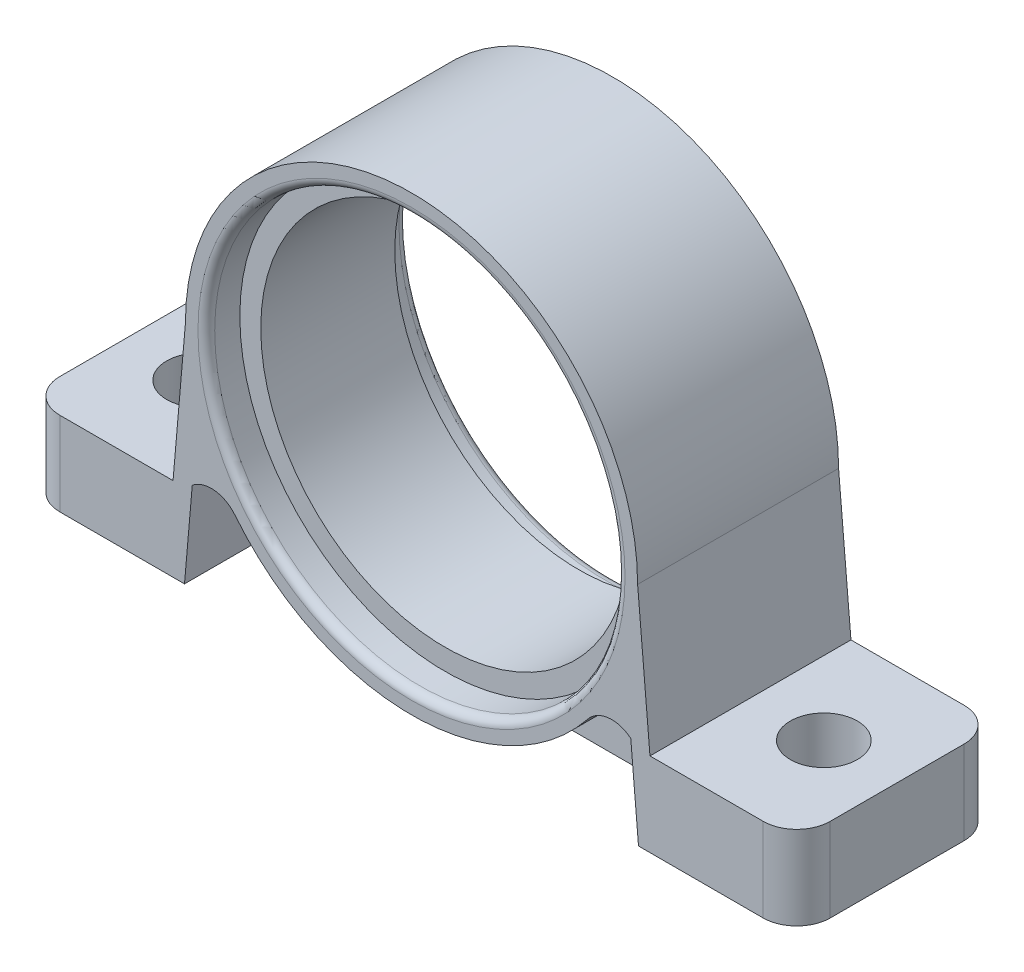
ISO-10303-21;
HEADER;
FILE_DESCRIPTION(('STEP AP214'),'2;1');
FILE_NAME('part.step','',(''),(''),'','','');
FILE_SCHEMA(('AUTOMOTIVE_DESIGN { 1 0 10303 214 1 1 1 1 }'));
ENDSEC;
DATA;
#1=APPLICATION_CONTEXT('core data for automotive mechanical design processes');
#2=APPLICATION_PROTOCOL_DEFINITION('international standard','automotive_design',2000,#1);
#3=PRODUCT_CONTEXT('',#1,'mechanical');
#4=PRODUCT('Part','Part','',(#3));
#5=PRODUCT_RELATED_PRODUCT_CATEGORY('part','',(#4));
#6=PRODUCT_DEFINITION_FORMATION('','',#4);
#7=PRODUCT_DEFINITION_CONTEXT('part definition',#1,'design');
#8=PRODUCT_DEFINITION('design','',#6,#7);
#9=PRODUCT_DEFINITION_SHAPE('','',#8);
#10=(LENGTH_UNIT() NAMED_UNIT(*) SI_UNIT(.MILLI.,.METRE.));
#11=(NAMED_UNIT(*) PLANE_ANGLE_UNIT() SI_UNIT($,.RADIAN.));
#12=(NAMED_UNIT(*) SI_UNIT($,.STERADIAN.) SOLID_ANGLE_UNIT());
#13=UNCERTAINTY_MEASURE_WITH_UNIT(LENGTH_MEASURE(1.E-05),#10,'distance_accuracy_value','');
#14=(GEOMETRIC_REPRESENTATION_CONTEXT(3) GLOBAL_UNCERTAINTY_ASSIGNED_CONTEXT((#13)) GLOBAL_UNIT_ASSIGNED_CONTEXT((#10,
#11,#12)) REPRESENTATION_CONTEXT('',''));
#15=CARTESIAN_POINT('',(0.,0.,0.));
#16=DIRECTION('',(0.,0.,1.));
#17=DIRECTION('',(1.,0.,0.));
#18=AXIS2_PLACEMENT_3D('',#15,#16,#17);
#19=CARTESIAN_POINT('',(0.,0.,6.));
#20=DIRECTION('',(0.,0.,-1.));
#21=DIRECTION('',(-1.,0.,0.));
#22=AXIS2_PLACEMENT_3D('',#19,#20,#21);
#23=CYLINDRICAL_SURFACE('',#22,11.);
#24=CARTESIAN_POINT('',(0.,0.,4.));
#25=DIRECTION('',(0.,0.,1.));
#26=DIRECTION('',(1.,0.,0.));
#27=AXIS2_PLACEMENT_3D('',#24,#25,#26);
#28=CIRCLE('',#27,11.);
#29=CARTESIAN_POINT('',(11.,0.,4.));
#30=VERTEX_POINT('',#29);
#31=EDGE_CURVE('E368',#30,#30,#28,.T.);
#32=ORIENTED_EDGE('',*,*,#31,.T.);
#33=EDGE_LOOP('',(#32));
#34=FACE_BOUND('',#33,.T.);
#35=CARTESIAN_POINT('',(0.,0.,-4.));
#36=DIRECTION('',(0.,0.,-1.));
#37=DIRECTION('',(-1.,0.,0.));
#38=AXIS2_PLACEMENT_3D('',#35,#36,#37);
#39=CIRCLE('',#38,11.);
#40=CARTESIAN_POINT('',(-11.,0.,-4.));
#41=VERTEX_POINT('',#40);
#42=EDGE_CURVE('E374',#41,#41,#39,.T.);
#43=ORIENTED_EDGE('',*,*,#42,.T.);
#44=EDGE_LOOP('',(#43));
#45=FACE_BOUND('',#44,.T.);
#46=ADVANCED_FACE('F42',(#34,#45),#23,.F.);
#47=CARTESIAN_POINT('',(12.2892180362991,1.06690695806387,-6.));
#48=DIRECTION('',(-0.99625261729607,-0.0864911702472008,0.));
#49=DIRECTION('',(0.0864911702472008,-0.99625261729607,0.));
#50=AXIS2_PLACEMENT_3D('',#47,#48,#49);
#51=PLANE('',#50);
#52=DIRECTION('',(0.,0.,1.));
#53=VECTOR('',#52,1.);
#54=CARTESIAN_POINT('',(13.0907777832913,-8.16589673250727,-6.));
#55=LINE('',#54,#53);
#56=CARTESIAN_POINT('',(13.0907777832913,-8.16589673250727,2.));
#57=VERTEX_POINT('',#56);
#58=CARTESIAN_POINT('',(13.0907777832913,-8.16589673250727,6.));
#59=VERTEX_POINT('',#58);
#60=EDGE_CURVE('E273',#57,#59,#55,.T.);
#61=ORIENTED_EDGE('',*,*,#60,.F.);
#62=DIRECTION('',(-0.0864911702472005,0.99625261729607,0.));
#63=VECTOR('',#62,1.);
#64=CARTESIAN_POINT('',(13.5538659858368,-13.5,2.));
#65=LINE('',#64,#63);
#66=CARTESIAN_POINT('',(13.5538659858368,-13.5,2.));
#67=VERTEX_POINT('',#66);
#68=EDGE_CURVE('E239',#67,#57,#65,.T.);
#69=ORIENTED_EDGE('',*,*,#68,.F.);
#70=DIRECTION('',(0.,0.,1.));
#71=VECTOR('',#70,1.);
#72=CARTESIAN_POINT('',(13.5538659858368,-13.5,-6.));
#73=LINE('',#72,#71);
#74=CARTESIAN_POINT('',(13.5538659858368,-13.5,6.));
#75=VERTEX_POINT('',#74);
#76=EDGE_CURVE('E237',#67,#75,#73,.T.);
#77=ORIENTED_EDGE('',*,*,#76,.T.);
#78=DIRECTION('',(0.0864911702472008,-0.99625261729607,0.));
#79=VECTOR('',#78,1.);
#80=CARTESIAN_POINT('',(12.2892180362991,1.06690695806387,6.));
#81=LINE('',#80,#79);
#82=EDGE_CURVE('E225',#59,#75,#81,.T.);
#83=ORIENTED_EDGE('',*,*,#82,.F.);
#84=EDGE_LOOP('',(#61,#69,#77,#83));
#85=FACE_BOUND('',#84,.T.);
#86=ADVANCED_FACE('F453',(#85),#51,.T.);
#87=CARTESIAN_POINT('',(-12.2892180362991,1.06690695806387,-6.));
#88=DIRECTION('',(-0.99625261729607,0.0864911702472008,0.));
#89=DIRECTION('',(-0.0864911702472008,-0.99625261729607,0.));
#90=AXIS2_PLACEMENT_3D('',#87,#88,#89);
#91=PLANE('',#90);
#92=DIRECTION('',(-0.0864911702472008,-0.99625261729607,0.));
#93=VECTOR('',#92,1.);
#94=CARTESIAN_POINT('',(-12.2892180362991,1.06690695806387,2.));
#95=LINE('',#94,#93);
#96=CARTESIAN_POINT('',(-13.0907777832913,-8.16589673250727,2.));
#97=VERTEX_POINT('',#96);
#98=CARTESIAN_POINT('',(-13.5538659858368,-13.5,2.));
#99=VERTEX_POINT('',#98);
#100=EDGE_CURVE('E213',#97,#99,#95,.T.);
#101=ORIENTED_EDGE('',*,*,#100,.F.);
#102=DIRECTION('',(0.,0.,1.));
#103=VECTOR('',#102,1.);
#104=CARTESIAN_POINT('',(-13.0907777832913,-8.16589673250727,-6.));
#105=LINE('',#104,#103);
#106=CARTESIAN_POINT('',(-13.0907777832913,-8.16589673250727,6.));
#107=VERTEX_POINT('',#106);
#108=EDGE_CURVE('E253',#97,#107,#105,.T.);
#109=ORIENTED_EDGE('',*,*,#108,.T.);
#110=DIRECTION('',(-0.0864911702472008,-0.99625261729607,0.));
#111=VECTOR('',#110,1.);
#112=CARTESIAN_POINT('',(-12.2892180362991,1.06690695806387,6.));
#113=LINE('',#112,#111);
#114=CARTESIAN_POINT('',(-13.5538659858368,-13.5,6.));
#115=VERTEX_POINT('',#114);
#116=EDGE_CURVE('E244',#107,#115,#113,.T.);
#117=ORIENTED_EDGE('',*,*,#116,.T.);
#118=DIRECTION('',(0.,0.,1.));
#119=VECTOR('',#118,1.);
#120=CARTESIAN_POINT('',(-13.5538659858368,-13.5,-6.));
#121=LINE('',#120,#119);
#122=EDGE_CURVE('E234',#99,#115,#121,.T.);
#123=ORIENTED_EDGE('',*,*,#122,.F.);
#124=EDGE_LOOP('',(#101,#109,#117,#123));
#125=FACE_BOUND('',#124,.T.);
#126=ADVANCED_FACE('F242',(#125),#91,.F.);
#127=CARTESIAN_POINT('',(-11.9488511266601,-9.56390599936307,-6.));
#128=DIRECTION('',(0.,0.,1.));
#129=DIRECTION('',(1.,0.,0.));
#130=AXIS2_PLACEMENT_3D('',#127,#128,#129);
#131=CYLINDRICAL_SURFACE('',#130,1.80511118752826);
#132=ORIENTED_EDGE('',*,*,#108,.F.);
#133=CARTESIAN_POINT('',(-11.9488511266601,-9.56390599936307,2.));
#134=DIRECTION('',(0.,0.,-1.));
#135=DIRECTION('',(-1.,0.,0.));
#136=AXIS2_PLACEMENT_3D('',#133,#134,#135);
#137=CIRCLE('',#136,1.80511118752826);
#138=CARTESIAN_POINT('',(-10.5395737474681,-8.43591501188242,2.));
#139=VERTEX_POINT('',#138);
#140=EDGE_CURVE('E220',#97,#139,#137,.T.);
#141=ORIENTED_EDGE('',*,*,#140,.T.);
#142=DIRECTION('',(0.,0.,1.));
#143=VECTOR('',#142,1.);
#144=CARTESIAN_POINT('',(-10.5395737474681,-8.43591501188242,-6.));
#145=LINE('',#144,#143);
#146=CARTESIAN_POINT('',(-10.5395737474681,-8.43591501188242,6.));
#147=VERTEX_POINT('',#146);
#148=EDGE_CURVE('E263',#139,#147,#145,.T.);
#149=ORIENTED_EDGE('',*,*,#148,.T.);
#150=CARTESIAN_POINT('',(-11.9488511266601,-9.56390599936307,6.));
#151=DIRECTION('',(0.,0.,1.));
#152=DIRECTION('',(1.,0.,0.));
#153=AXIS2_PLACEMENT_3D('',#150,#151,#152);
#154=CIRCLE('',#153,1.80511118752826);
#155=EDGE_CURVE('E558',#107,#147,#154,.F.);
#156=ORIENTED_EDGE('',*,*,#155,.F.);
#157=EDGE_LOOP('',(#132,#141,#149,#156));
#158=FACE_BOUND('',#157,.T.);
#159=ADVANCED_FACE('F648',(#158),#131,.F.);
#160=CARTESIAN_POINT('',(0.,0.,-6.));
#161=DIRECTION('',(0.,0.,1.));
#162=DIRECTION('',(1.,0.,0.));
#163=AXIS2_PLACEMENT_3D('',#160,#161,#162);
#164=CYLINDRICAL_SURFACE('',#163,13.4998991428093);
#165=ORIENTED_EDGE('',*,*,#148,.F.);
#166=CARTESIAN_POINT('',(0.,0.,2.));
#167=DIRECTION('',(0.,0.,-1.));
#168=DIRECTION('',(-1.,0.,0.));
#169=AXIS2_PLACEMENT_3D('',#166,#167,#168);
#170=CIRCLE('',#169,13.4998991428093);
#171=CARTESIAN_POINT('',(10.5395737474681,-8.43591501188242,2.));
#172=VERTEX_POINT('',#171);
#173=EDGE_CURVE('E642',#139,#172,#170,.F.);
#174=ORIENTED_EDGE('',*,*,#173,.T.);
#175=DIRECTION('',(0.,0.,1.));
#176=VECTOR('',#175,1.);
#177=CARTESIAN_POINT('',(10.5395737474681,-8.43591501188242,-6.));
#178=LINE('',#177,#176);
#179=CARTESIAN_POINT('',(10.5395737474681,-8.43591501188242,6.));
#180=VERTEX_POINT('',#179);
#181=EDGE_CURVE('E268',#172,#180,#178,.T.);
#182=ORIENTED_EDGE('',*,*,#181,.T.);
#183=CARTESIAN_POINT('',(0.,0.,6.));
#184=DIRECTION('',(0.,0.,1.));
#185=DIRECTION('',(1.,0.,0.));
#186=AXIS2_PLACEMENT_3D('',#183,#184,#185);
#187=CIRCLE('',#186,13.4998991428093);
#188=EDGE_CURVE('E554',#147,#180,#187,.T.);
#189=ORIENTED_EDGE('',*,*,#188,.F.);
#190=EDGE_LOOP('',(#165,#174,#182,#189));
#191=FACE_BOUND('',#190,.T.);
#192=ADVANCED_FACE('F651',(#191),#164,.T.);
#193=CARTESIAN_POINT('',(11.9488511266601,-9.56390599936307,-6.));
#194=DIRECTION('',(0.,0.,1.));
#195=DIRECTION('',(1.,0.,0.));
#196=AXIS2_PLACEMENT_3D('',#193,#194,#195);
#197=CYLINDRICAL_SURFACE('',#196,1.80511118752826);
#198=CARTESIAN_POINT('',(11.9488511266601,-9.56390599936307,2.));
#199=DIRECTION('',(0.,0.,-1.));
#200=DIRECTION('',(-1.,0.,0.));
#201=AXIS2_PLACEMENT_3D('',#198,#199,#200);
#202=CIRCLE('',#201,1.80511118752826);
#203=CARTESIAN_POINT('',(12.8657604939048,-8.00900934311915,2.));
#204=VERTEX_POINT('',#203);
#205=EDGE_CURVE('E364',#204,#172,#202,.F.);
#206=ORIENTED_EDGE('',*,*,#205,.F.);
#207=DIRECTION('',(0.,0.,1.));
#208=VECTOR('',#207,1.);
#209=CARTESIAN_POINT('',(12.8657604939048,-8.00900934311916,-6.));
#210=LINE('',#209,#208);
#211=CARTESIAN_POINT('',(12.8657604939048,-8.00900934311915,-2.));
#212=VERTEX_POINT('',#211);
#213=EDGE_CURVE('E361',#212,#204,#210,.T.);
#214=ORIENTED_EDGE('',*,*,#213,.F.);
#215=CARTESIAN_POINT('',(11.9488511266601,-9.56390599936307,-2.));
#216=DIRECTION('',(0.,0.,-1.));
#217=DIRECTION('',(-1.,0.,0.));
#218=AXIS2_PLACEMENT_3D('',#215,#216,#217);
#219=CIRCLE('',#218,1.80511118752826);
#220=CARTESIAN_POINT('',(10.5395737474681,-8.43591501188242,-2.));
#221=VERTEX_POINT('',#220);
#222=EDGE_CURVE('E357',#212,#221,#219,.F.);
#223=ORIENTED_EDGE('',*,*,#222,.T.);
#224=CARTESIAN_POINT('',(10.5395737474681,-8.43591501188242,-6.));
#225=VERTEX_POINT('',#224);
#226=EDGE_CURVE('E264',#225,#221,#178,.T.);
#227=ORIENTED_EDGE('',*,*,#226,.F.);
#228=CARTESIAN_POINT('',(11.9488511266601,-9.56390599936307,-6.));
#229=DIRECTION('',(0.,0.,1.));
#230=DIRECTION('',(1.,0.,0.));
#231=AXIS2_PLACEMENT_3D('',#228,#229,#230);
#232=CIRCLE('',#231,1.80511118752826);
#233=CARTESIAN_POINT('',(13.0907777832913,-8.16589673250727,-6.));
#234=VERTEX_POINT('',#233);
#235=EDGE_CURVE('E564',#234,#225,#232,.T.);
#236=ORIENTED_EDGE('',*,*,#235,.F.);
#237=CARTESIAN_POINT('',(13.0907777832913,-8.16589673250727,-2.));
#238=VERTEX_POINT('',#237);
#239=EDGE_CURVE('E269',#234,#238,#55,.T.);
#240=ORIENTED_EDGE('',*,*,#239,.T.);
#241=DIRECTION('',(0.,0.,-1.));
#242=VECTOR('',#241,1.);
#243=CARTESIAN_POINT('',(13.0907777832913,-8.16589673250727,2.));
#244=LINE('',#243,#242);
#245=EDGE_CURVE('E619',#57,#238,#244,.T.);
#246=ORIENTED_EDGE('',*,*,#245,.F.);
#247=ORIENTED_EDGE('',*,*,#60,.T.);
#248=CARTESIAN_POINT('',(11.9488511266601,-9.56390599936307,6.));
#249=DIRECTION('',(0.,0.,1.));
#250=DIRECTION('',(1.,0.,0.));
#251=AXIS2_PLACEMENT_3D('',#248,#249,#250);
#252=CIRCLE('',#251,1.80511118752826);
#253=EDGE_CURVE('E550',#59,#180,#252,.T.);
#254=ORIENTED_EDGE('',*,*,#253,.T.);
#255=ORIENTED_EDGE('',*,*,#181,.F.);
#256=EDGE_LOOP('',(#206,#214,#223,#227,#236,#240,#246,#247,#254,#255));
#257=FACE_BOUND('',#256,.T.);
#258=ADVANCED_FACE('F471',(#257),#197,.F.);
#259=CARTESIAN_POINT('',(0.,0.,6.));
#260=DIRECTION('',(0.,0.,1.));
#261=DIRECTION('',(1.,0.,0.));
#262=AXIS2_PLACEMENT_3D('',#259,#260,#261);
#263=PLANE('',#262);
#264=CARTESIAN_POINT('',(0.,0.,6.));
#265=DIRECTION('',(0.,0.,1.));
#266=DIRECTION('',(1.,0.,0.));
#267=AXIS2_PLACEMENT_3D('',#264,#265,#266);
#268=CIRCLE('',#267,12.7499999999999);
#269=CARTESIAN_POINT('',(12.7499999999999,0.,6.));
#270=VERTEX_POINT('',#269);
#271=EDGE_CURVE('E433',#270,#270,#268,.F.);
#272=ORIENTED_EDGE('',*,*,#271,.T.);
#273=EDGE_LOOP('',(#272));
#274=FACE_BOUND('',#273,.T.);
#275=DIRECTION('',(-1.,0.,0.));
#276=VECTOR('',#275,1.);
#277=CARTESIAN_POINT('',(-23.,-8.5,6.));
#278=LINE('',#277,#276);
#279=CARTESIAN_POINT('',(-14.2379402917872,-8.5,6.));
#280=VERTEX_POINT('',#279);
#281=CARTESIAN_POINT('',(-21.,-8.5,6.));
#282=VERTEX_POINT('',#281);
#283=EDGE_CURVE('E307',#280,#282,#278,.T.);
#284=ORIENTED_EDGE('',*,*,#283,.T.);
#285=DIRECTION('',(0.,-1.,0.));
#286=VECTOR('',#285,1.);
#287=CARTESIAN_POINT('',(-21.,-13.5,6.));
#288=LINE('',#287,#286);
#289=CARTESIAN_POINT('',(-21.,-13.5,6.));
#290=VERTEX_POINT('',#289);
#291=EDGE_CURVE('E425',#282,#290,#288,.T.);
#292=ORIENTED_EDGE('',*,*,#291,.T.);
#293=DIRECTION('',(1.,0.,0.));
#294=VECTOR('',#293,1.);
#295=CARTESIAN_POINT('',(23.,-13.5,6.));
#296=LINE('',#295,#294);
#297=EDGE_CURVE('E291',#290,#115,#296,.T.);
#298=ORIENTED_EDGE('',*,*,#297,.T.);
#299=ORIENTED_EDGE('',*,*,#116,.F.);
#300=ORIENTED_EDGE('',*,*,#155,.T.);
#301=ORIENTED_EDGE('',*,*,#188,.T.);
#302=ORIENTED_EDGE('',*,*,#253,.F.);
#303=ORIENTED_EDGE('',*,*,#82,.T.);
#304=CARTESIAN_POINT('',(21.,-13.5,6.));
#305=VERTEX_POINT('',#304);
#306=EDGE_CURVE('E295',#75,#305,#296,.T.);
#307=ORIENTED_EDGE('',*,*,#306,.T.);
#308=DIRECTION('',(0.,1.,0.));
#309=VECTOR('',#308,1.);
#310=CARTESIAN_POINT('',(21.,-8.5,6.));
#311=LINE('',#310,#309);
#312=CARTESIAN_POINT('',(21.,-8.5,6.));
#313=VERTEX_POINT('',#312);
#314=EDGE_CURVE('E392',#305,#313,#311,.T.);
#315=ORIENTED_EDGE('',*,*,#314,.T.);
#316=DIRECTION('',(-1.,0.,0.));
#317=VECTOR('',#316,1.);
#318=CARTESIAN_POINT('',(23.,-8.5,6.));
#319=LINE('',#318,#317);
#320=CARTESIAN_POINT('',(14.2379402917872,-8.5,6.));
#321=VERTEX_POINT('',#320);
#322=EDGE_CURVE('E294',#313,#321,#319,.T.);
#323=ORIENTED_EDGE('',*,*,#322,.T.);
#324=DIRECTION('',(-0.0864911702472007,0.99625261729607,0.));
#325=VECTOR('',#324,1.);
#326=CARTESIAN_POINT('',(13.5,0.,6.));
#327=LINE('',#326,#325);
#328=CARTESIAN_POINT('',(13.5,0.,6.));
#329=VERTEX_POINT('',#328);
#330=EDGE_CURVE('E298',#321,#329,#327,.T.);
#331=ORIENTED_EDGE('',*,*,#330,.T.);
#332=CARTESIAN_POINT('',(0.,0.,6.));
#333=DIRECTION('',(0.,0.,1.));
#334=DIRECTION('',(1.,0.,0.));
#335=AXIS2_PLACEMENT_3D('',#332,#333,#334);
#336=CIRCLE('',#335,13.5);
#337=CARTESIAN_POINT('',(-13.5,0.,6.));
#338=VERTEX_POINT('',#337);
#339=EDGE_CURVE('E301',#329,#338,#336,.T.);
#340=ORIENTED_EDGE('',*,*,#339,.T.);
#341=DIRECTION('',(-0.0864911702472007,-0.99625261729607,0.));
#342=VECTOR('',#341,1.);
#343=CARTESIAN_POINT('',(-13.5,0.,6.));
#344=LINE('',#343,#342);
#345=EDGE_CURVE('E304',#338,#280,#344,.T.);
#346=ORIENTED_EDGE('',*,*,#345,.T.);
#347=EDGE_LOOP('',(#284,#292,#298,#299,#300,#301,#302,#303,#307,#315,#323,#331,#340,#346));
#348=FACE_BOUND('',#347,.T.);
#349=ADVANCED_FACE('F467',(#274,#348),#263,.T.);
#350=CARTESIAN_POINT('',(0.,0.,-6.));
#351=DIRECTION('',(0.,0.,1.));
#352=DIRECTION('',(1.,0.,0.));
#353=AXIS2_PLACEMENT_3D('',#350,#351,#352);
#354=PLANE('',#353);
#355=CARTESIAN_POINT('',(0.,0.,-6.));
#356=DIRECTION('',(0.,0.,1.));
#357=DIRECTION('',(1.,0.,0.));
#358=AXIS2_PLACEMENT_3D('',#355,#356,#357);
#359=CIRCLE('',#358,12.75);
#360=CARTESIAN_POINT('',(12.75,0.,-6.));
#361=VERTEX_POINT('',#360);
#362=EDGE_CURVE('E11',#361,#361,#359,.T.);
#363=ORIENTED_EDGE('',*,*,#362,.T.);
#364=EDGE_LOOP('',(#363));
#365=FACE_BOUND('',#364,.T.);
#366=DIRECTION('',(1.,0.,0.));
#367=VECTOR('',#366,1.);
#368=CARTESIAN_POINT('',(23.,-13.5,-6.));
#369=LINE('',#368,#367);
#370=CARTESIAN_POINT('',(-21.,-13.5,-6.));
#371=VERTEX_POINT('',#370);
#372=CARTESIAN_POINT('',(-13.5538659858368,-13.5,-6.));
#373=VERTEX_POINT('',#372);
#374=EDGE_CURVE('E311',#371,#373,#369,.T.);
#375=ORIENTED_EDGE('',*,*,#374,.F.);
#376=DIRECTION('',(0.,-1.,0.));
#377=VECTOR('',#376,1.);
#378=CARTESIAN_POINT('',(-21.,0.,-6.));
#379=LINE('',#378,#377);
#380=CARTESIAN_POINT('',(-21.,-8.5,-6.));
#381=VERTEX_POINT('',#380);
#382=EDGE_CURVE('E66',#371,#381,#379,.F.);
#383=ORIENTED_EDGE('',*,*,#382,.T.);
#384=DIRECTION('',(-1.,0.,0.));
#385=VECTOR('',#384,1.);
#386=CARTESIAN_POINT('',(-23.,-8.5,-6.));
#387=LINE('',#386,#385);
#388=CARTESIAN_POINT('',(-14.2379402917872,-8.5,-6.));
#389=VERTEX_POINT('',#388);
#390=EDGE_CURVE('E326',#389,#381,#387,.T.);
#391=ORIENTED_EDGE('',*,*,#390,.F.);
#392=DIRECTION('',(-0.0864911702472007,-0.99625261729607,0.));
#393=VECTOR('',#392,1.);
#394=CARTESIAN_POINT('',(-13.5,0.,-6.));
#395=LINE('',#394,#393);
#396=CARTESIAN_POINT('',(-13.5,0.,-6.));
#397=VERTEX_POINT('',#396);
#398=EDGE_CURVE('E323',#397,#389,#395,.T.);
#399=ORIENTED_EDGE('',*,*,#398,.F.);
#400=CARTESIAN_POINT('',(0.,0.,-6.));
#401=DIRECTION('',(0.,0.,1.));
#402=DIRECTION('',(1.,0.,0.));
#403=AXIS2_PLACEMENT_3D('',#400,#401,#402);
#404=CIRCLE('',#403,13.5);
#405=CARTESIAN_POINT('',(13.5,0.,-6.));
#406=VERTEX_POINT('',#405);
#407=EDGE_CURVE('E320',#406,#397,#404,.T.);
#408=ORIENTED_EDGE('',*,*,#407,.F.);
#409=DIRECTION('',(-0.0864911702472007,0.99625261729607,0.));
#410=VECTOR('',#409,1.);
#411=CARTESIAN_POINT('',(13.5,0.,-6.));
#412=LINE('',#411,#410);
#413=CARTESIAN_POINT('',(14.2379402917872,-8.5,-6.));
#414=VERTEX_POINT('',#413);
#415=EDGE_CURVE('E317',#414,#406,#412,.T.);
#416=ORIENTED_EDGE('',*,*,#415,.F.);
#417=DIRECTION('',(-1.,0.,0.));
#418=VECTOR('',#417,1.);
#419=CARTESIAN_POINT('',(23.,-8.5,-6.));
#420=LINE('',#419,#418);
#421=CARTESIAN_POINT('',(21.,-8.5,-6.));
#422=VERTEX_POINT('',#421);
#423=EDGE_CURVE('E314',#422,#414,#420,.T.);
#424=ORIENTED_EDGE('',*,*,#423,.F.);
#425=DIRECTION('',(0.,1.,0.));
#426=VECTOR('',#425,1.);
#427=CARTESIAN_POINT('',(21.,0.,-6.));
#428=LINE('',#427,#426);
#429=CARTESIAN_POINT('',(21.,-13.5,-6.));
#430=VERTEX_POINT('',#429);
#431=EDGE_CURVE('E385',#422,#430,#428,.F.);
#432=ORIENTED_EDGE('',*,*,#431,.T.);
#433=CARTESIAN_POINT('',(13.5538659858368,-13.5,-6.));
#434=VERTEX_POINT('',#433);
#435=EDGE_CURVE('E278',#434,#430,#369,.T.);
#436=ORIENTED_EDGE('',*,*,#435,.F.);
#437=DIRECTION('',(0.0864911702472008,-0.99625261729607,0.));
#438=VECTOR('',#437,1.);
#439=CARTESIAN_POINT('',(12.2892180362991,1.06690695806387,-6.));
#440=LINE('',#439,#438);
#441=EDGE_CURVE('E562',#234,#434,#440,.T.);
#442=ORIENTED_EDGE('',*,*,#441,.F.);
#443=ORIENTED_EDGE('',*,*,#235,.T.);
#444=CARTESIAN_POINT('',(0.,0.,-6.));
#445=DIRECTION('',(0.,0.,1.));
#446=DIRECTION('',(1.,0.,0.));
#447=AXIS2_PLACEMENT_3D('',#444,#445,#446);
#448=CIRCLE('',#447,13.4998991428093);
#449=CARTESIAN_POINT('',(-10.5395737474681,-8.43591501188242,-6.));
#450=VERTEX_POINT('',#449);
#451=EDGE_CURVE('E543',#450,#225,#448,.T.);
#452=ORIENTED_EDGE('',*,*,#451,.F.);
#453=CARTESIAN_POINT('',(-11.9488511266601,-9.56390599936307,-6.));
#454=DIRECTION('',(0.,0.,1.));
#455=DIRECTION('',(1.,0.,0.));
#456=AXIS2_PLACEMENT_3D('',#453,#454,#455);
#457=CIRCLE('',#456,1.80511118752826);
#458=CARTESIAN_POINT('',(-13.0907777832913,-8.16589673250727,-6.));
#459=VERTEX_POINT('',#458);
#460=EDGE_CURVE('E537',#459,#450,#457,.F.);
#461=ORIENTED_EDGE('',*,*,#460,.F.);
#462=DIRECTION('',(-0.0864911702472008,-0.99625261729607,0.));
#463=VECTOR('',#462,1.);
#464=CARTESIAN_POINT('',(-12.2892180362991,1.06690695806387,-6.));
#465=LINE('',#464,#463);
#466=EDGE_CURVE('E535',#459,#373,#465,.T.);
#467=ORIENTED_EDGE('',*,*,#466,.T.);
#468=EDGE_LOOP('',(#375,#383,#391,#399,#408,#416,#424,#432,#436,#442,#443,#452,#461,#467));
#469=FACE_BOUND('',#468,.T.);
#470=ADVANCED_FACE('F470',(#365,#469),#354,.F.);
#471=CARTESIAN_POINT('',(-23.,-13.5,6.));
#472=DIRECTION('',(1.,0.,0.));
#473=DIRECTION('',(0.,0.,-1.));
#474=AXIS2_PLACEMENT_3D('',#471,#472,#473);
#475=PLANE('',#474);
#476=DIRECTION('',(0.,0.,-1.));
#477=VECTOR('',#476,1.);
#478=CARTESIAN_POINT('',(-23.,-8.5,6.));
#479=LINE('',#478,#477);
#480=CARTESIAN_POINT('',(-23.,-8.5,4.));
#481=VERTEX_POINT('',#480);
#482=CARTESIAN_POINT('',(-23.,-8.5,-4.));
#483=VERTEX_POINT('',#482);
#484=EDGE_CURVE('E310',#481,#483,#479,.T.);
#485=ORIENTED_EDGE('',*,*,#484,.T.);
#486=DIRECTION('',(0.,-1.,0.));
#487=VECTOR('',#486,1.);
#488=CARTESIAN_POINT('',(-23.,-13.5,-4.));
#489=LINE('',#488,#487);
#490=CARTESIAN_POINT('',(-23.,-13.5,-4.));
#491=VERTEX_POINT('',#490);
#492=EDGE_CURVE('E408',#483,#491,#489,.T.);
#493=ORIENTED_EDGE('',*,*,#492,.T.);
#494=DIRECTION('',(0.,0.,-1.));
#495=VECTOR('',#494,1.);
#496=CARTESIAN_POINT('',(-23.,-13.5,6.));
#497=LINE('',#496,#495);
#498=CARTESIAN_POINT('',(-23.,-13.5,4.));
#499=VERTEX_POINT('',#498);
#500=EDGE_CURVE('E354',#499,#491,#497,.T.);
#501=ORIENTED_EDGE('',*,*,#500,.F.);
#502=DIRECTION('',(0.,-1.,0.));
#503=VECTOR('',#502,1.);
#504=CARTESIAN_POINT('',(-23.,-8.5,4.));
#505=LINE('',#504,#503);
#506=EDGE_CURVE('E405',#499,#481,#505,.F.);
#507=ORIENTED_EDGE('',*,*,#506,.T.);
#508=EDGE_LOOP('',(#485,#493,#501,#507));
#509=FACE_BOUND('',#508,.T.);
#510=ADVANCED_FACE('F475',(#509),#475,.F.);
#511=CARTESIAN_POINT('',(23.,-13.5,6.));
#512=DIRECTION('',(0.,1.,0.));
#513=DIRECTION('',(0.,0.,1.));
#514=AXIS2_PLACEMENT_3D('',#511,#512,#513);
#515=PLANE('',#514);
#516=CARTESIAN_POINT('',(-18.6189701458936,-13.5,0.));
#517=DIRECTION('',(0.,1.,0.));
#518=DIRECTION('',(0.,0.,1.));
#519=AXIS2_PLACEMENT_3D('',#516,#517,#518);
#520=CIRCLE('',#519,2.);
#521=CARTESIAN_POINT('',(-18.6189701458936,-13.5,2.));
#522=VERTEX_POINT('',#521);
#523=EDGE_CURVE('E274',#522,#522,#520,.T.);
#524=ORIENTED_EDGE('',*,*,#523,.T.);
#525=EDGE_LOOP('',(#524));
#526=FACE_BOUND('',#525,.T.);
#527=ORIENTED_EDGE('',*,*,#500,.T.);
#528=CARTESIAN_POINT('',(-21.,-13.5,-4.));
#529=DIRECTION('',(0.,1.,0.));
#530=DIRECTION('',(0.,0.,1.));
#531=AXIS2_PLACEMENT_3D('',#528,#529,#530);
#532=CIRCLE('',#531,2.);
#533=EDGE_CURVE('E415',#491,#371,#532,.F.);
#534=ORIENTED_EDGE('',*,*,#533,.T.);
#535=ORIENTED_EDGE('',*,*,#374,.T.);
#536=CARTESIAN_POINT('',(-13.5538659858368,-13.5,-2.));
#537=VERTEX_POINT('',#536);
#538=EDGE_CURVE('E246',#373,#537,#121,.T.);
#539=ORIENTED_EDGE('',*,*,#538,.T.);
#540=DIRECTION('',(1.,0.,0.));
#541=VECTOR('',#540,1.);
#542=CARTESIAN_POINT('',(-13.5538659858368,-13.5,-2.));
#543=LINE('',#542,#541);
#544=CARTESIAN_POINT('',(13.5538659858368,-13.5,-2.));
#545=VERTEX_POINT('',#544);
#546=EDGE_CURVE('E372',#537,#545,#543,.T.);
#547=ORIENTED_EDGE('',*,*,#546,.T.);
#548=EDGE_CURVE('E256',#434,#545,#73,.T.);
#549=ORIENTED_EDGE('',*,*,#548,.F.);
#550=ORIENTED_EDGE('',*,*,#435,.T.);
#551=CARTESIAN_POINT('',(21.,-13.5,-4.));
#552=DIRECTION('',(0.,1.,0.));
#553=DIRECTION('',(0.,0.,1.));
#554=AXIS2_PLACEMENT_3D('',#551,#552,#553);
#555=CIRCLE('',#554,2.);
#556=CARTESIAN_POINT('',(23.,-13.5,-4.));
#557=VERTEX_POINT('',#556);
#558=EDGE_CURVE('E388',#430,#557,#555,.F.);
#559=ORIENTED_EDGE('',*,*,#558,.T.);
#560=DIRECTION('',(0.,0.,-1.));
#561=VECTOR('',#560,1.);
#562=CARTESIAN_POINT('',(23.,-13.5,6.));
#563=LINE('',#562,#561);
#564=CARTESIAN_POINT('',(23.,-13.5,4.));
#565=VERTEX_POINT('',#564);
#566=EDGE_CURVE('E351',#565,#557,#563,.T.);
#567=ORIENTED_EDGE('',*,*,#566,.F.);
#568=CARTESIAN_POINT('',(21.,-13.5,4.));
#569=DIRECTION('',(0.,1.,0.));
#570=DIRECTION('',(0.,0.,1.));
#571=AXIS2_PLACEMENT_3D('',#568,#569,#570);
#572=CIRCLE('',#571,2.);
#573=EDGE_CURVE('E402',#565,#305,#572,.F.);
#574=ORIENTED_EDGE('',*,*,#573,.T.);
#575=ORIENTED_EDGE('',*,*,#306,.F.);
#576=ORIENTED_EDGE('',*,*,#76,.F.);
#577=DIRECTION('',(1.,0.,0.));
#578=VECTOR('',#577,1.);
#579=CARTESIAN_POINT('',(-13.5538659858368,-13.5,2.));
#580=LINE('',#579,#578);
#581=EDGE_CURVE('E217',#99,#67,#580,.T.);
#582=ORIENTED_EDGE('',*,*,#581,.F.);
#583=ORIENTED_EDGE('',*,*,#122,.T.);
#584=ORIENTED_EDGE('',*,*,#297,.F.);
#585=CARTESIAN_POINT('',(-21.,-13.5,4.));
#586=DIRECTION('',(0.,1.,0.));
#587=DIRECTION('',(0.,0.,1.));
#588=AXIS2_PLACEMENT_3D('',#585,#586,#587);
#589=CIRCLE('',#588,2.);
#590=EDGE_CURVE('E412',#290,#499,#589,.F.);
#591=ORIENTED_EDGE('',*,*,#590,.T.);
#592=EDGE_LOOP('',(#527,#534,#535,#539,#547,#549,#550,#559,#567,#574,#575,#576,#582,#583,#584,#591));
#593=FACE_BOUND('',#592,.T.);
#594=CARTESIAN_POINT('',(18.6189701458936,-13.5,0.));
#595=DIRECTION('',(0.,1.,0.));
#596=DIRECTION('',(0.,0.,-1.));
#597=AXIS2_PLACEMENT_3D('',#594,#595,#596);
#598=CIRCLE('',#597,2.);
#599=CARTESIAN_POINT('',(18.6189701458936,-13.5,-2.));
#600=VERTEX_POINT('',#599);
#601=EDGE_CURVE('E283',#600,#600,#598,.T.);
#602=ORIENTED_EDGE('',*,*,#601,.T.);
#603=EDGE_LOOP('',(#602));
#604=FACE_BOUND('',#603,.T.);
#605=ADVANCED_FACE('F231',(#526,#593,#604),#515,.F.);
#606=CARTESIAN_POINT('',(23.,-13.5,6.));
#607=DIRECTION('',(-1.,0.,0.));
#608=DIRECTION('',(0.,0.,1.));
#609=AXIS2_PLACEMENT_3D('',#606,#607,#608);
#610=PLANE('',#609);
#611=DIRECTION('',(0.,0.,-1.));
#612=VECTOR('',#611,1.);
#613=CARTESIAN_POINT('',(23.,-8.5,6.));
#614=LINE('',#613,#612);
#615=CARTESIAN_POINT('',(23.,-8.5,4.));
#616=VERTEX_POINT('',#615);
#617=CARTESIAN_POINT('',(23.,-8.5,-4.));
#618=VERTEX_POINT('',#617);
#619=EDGE_CURVE('E348',#616,#618,#614,.T.);
#620=ORIENTED_EDGE('',*,*,#619,.F.);
#621=DIRECTION('',(0.,1.,0.));
#622=VECTOR('',#621,1.);
#623=CARTESIAN_POINT('',(23.,-13.5,4.));
#624=LINE('',#623,#622);
#625=EDGE_CURVE('E399',#616,#565,#624,.F.);
#626=ORIENTED_EDGE('',*,*,#625,.T.);
#627=ORIENTED_EDGE('',*,*,#566,.T.);
#628=DIRECTION('',(0.,1.,0.));
#629=VECTOR('',#628,1.);
#630=CARTESIAN_POINT('',(23.,-13.5,-4.));
#631=LINE('',#630,#629);
#632=EDGE_CURVE('E367',#557,#618,#631,.T.);
#633=ORIENTED_EDGE('',*,*,#632,.T.);
#634=EDGE_LOOP('',(#620,#626,#627,#633));
#635=FACE_BOUND('',#634,.T.);
#636=ADVANCED_FACE('F497',(#635),#610,.F.);
#637=CARTESIAN_POINT('',(23.,-8.5,6.));
#638=DIRECTION('',(0.,-1.,0.));
#639=DIRECTION('',(0.,0.,-1.));
#640=AXIS2_PLACEMENT_3D('',#637,#638,#639);
#641=PLANE('',#640);
#642=CARTESIAN_POINT('',(18.6189701458936,-8.5,0.));
#643=DIRECTION('',(0.,1.,0.));
#644=DIRECTION('',(0.,0.,-1.));
#645=AXIS2_PLACEMENT_3D('',#642,#643,#644);
#646=CIRCLE('',#645,2.);
#647=CARTESIAN_POINT('',(18.6189701458936,-8.5,-2.));
#648=VERTEX_POINT('',#647);
#649=EDGE_CURVE('E287',#648,#648,#646,.T.);
#650=ORIENTED_EDGE('',*,*,#649,.F.);
#651=EDGE_LOOP('',(#650));
#652=FACE_BOUND('',#651,.T.);
#653=ORIENTED_EDGE('',*,*,#322,.F.);
#654=CARTESIAN_POINT('',(21.,-8.5,4.));
#655=DIRECTION('',(0.,-1.,0.));
#656=DIRECTION('',(0.,0.,-1.));
#657=AXIS2_PLACEMENT_3D('',#654,#655,#656);
#658=CIRCLE('',#657,2.);
#659=EDGE_CURVE('E396',#313,#616,#658,.F.);
#660=ORIENTED_EDGE('',*,*,#659,.T.);
#661=ORIENTED_EDGE('',*,*,#619,.T.);
#662=CARTESIAN_POINT('',(21.,-8.5,-4.));
#663=DIRECTION('',(0.,-1.,0.));
#664=DIRECTION('',(0.,0.,-1.));
#665=AXIS2_PLACEMENT_3D('',#662,#663,#664);
#666=CIRCLE('',#665,2.);
#667=EDGE_CURVE('E382',#618,#422,#666,.F.);
#668=ORIENTED_EDGE('',*,*,#667,.T.);
#669=ORIENTED_EDGE('',*,*,#423,.T.);
#670=DIRECTION('',(0.,0.,-1.));
#671=VECTOR('',#670,1.);
#672=CARTESIAN_POINT('',(14.2379402917872,-8.5,6.));
#673=LINE('',#672,#671);
#674=EDGE_CURVE('E344',#321,#414,#673,.T.);
#675=ORIENTED_EDGE('',*,*,#674,.F.);
#676=EDGE_LOOP('',(#653,#660,#661,#668,#669,#675));
#677=FACE_BOUND('',#676,.T.);
#678=ADVANCED_FACE('F493',(#652,#677),#641,.F.);
#679=CARTESIAN_POINT('',(13.5,0.,6.));
#680=DIRECTION('',(-0.99625261729607,-0.0864911702472007,0.));
#681=DIRECTION('',(0.0864911702472007,-0.99625261729607,0.));
#682=AXIS2_PLACEMENT_3D('',#679,#680,#681);
#683=PLANE('',#682);
#684=ORIENTED_EDGE('',*,*,#415,.T.);
#685=DIRECTION('',(0.,0.,-1.));
#686=VECTOR('',#685,1.);
#687=CARTESIAN_POINT('',(13.5,0.,6.));
#688=LINE('',#687,#686);
#689=EDGE_CURVE('E340',#329,#406,#688,.T.);
#690=ORIENTED_EDGE('',*,*,#689,.F.);
#691=ORIENTED_EDGE('',*,*,#330,.F.);
#692=ORIENTED_EDGE('',*,*,#674,.T.);
#693=EDGE_LOOP('',(#684,#690,#691,#692));
#694=FACE_BOUND('',#693,.T.);
#695=ADVANCED_FACE('F489',(#694),#683,.F.);
#696=CARTESIAN_POINT('',(0.,0.,6.));
#697=DIRECTION('',(0.,0.,-1.));
#698=DIRECTION('',(-1.,0.,0.));
#699=AXIS2_PLACEMENT_3D('',#696,#697,#698);
#700=CYLINDRICAL_SURFACE('',#699,13.5);
#701=ORIENTED_EDGE('',*,*,#407,.T.);
#702=DIRECTION('',(0.,0.,-1.));
#703=VECTOR('',#702,1.);
#704=CARTESIAN_POINT('',(-13.5,0.,6.));
#705=LINE('',#704,#703);
#706=EDGE_CURVE('E336',#338,#397,#705,.T.);
#707=ORIENTED_EDGE('',*,*,#706,.F.);
#708=ORIENTED_EDGE('',*,*,#339,.F.);
#709=ORIENTED_EDGE('',*,*,#689,.T.);
#710=EDGE_LOOP('',(#701,#707,#708,#709));
#711=FACE_BOUND('',#710,.T.);
#712=ADVANCED_FACE('F485',(#711),#700,.T.);
#713=CARTESIAN_POINT('',(-13.5,0.,6.));
#714=DIRECTION('',(0.99625261729607,-0.0864911702472007,0.));
#715=DIRECTION('',(0.0864911702472007,0.99625261729607,0.));
#716=AXIS2_PLACEMENT_3D('',#713,#714,#715);
#717=PLANE('',#716);
#718=ORIENTED_EDGE('',*,*,#398,.T.);
#719=DIRECTION('',(0.,0.,-1.));
#720=VECTOR('',#719,1.);
#721=CARTESIAN_POINT('',(-14.2379402917872,-8.5,6.));
#722=LINE('',#721,#720);
#723=EDGE_CURVE('E332',#280,#389,#722,.T.);
#724=ORIENTED_EDGE('',*,*,#723,.F.);
#725=ORIENTED_EDGE('',*,*,#345,.F.);
#726=ORIENTED_EDGE('',*,*,#706,.T.);
#727=EDGE_LOOP('',(#718,#724,#725,#726));
#728=FACE_BOUND('',#727,.T.);
#729=ADVANCED_FACE('F481',(#728),#717,.F.);
#730=CARTESIAN_POINT('',(-23.,-8.5,6.));
#731=DIRECTION('',(0.,-1.,0.));
#732=DIRECTION('',(0.,0.,-1.));
#733=AXIS2_PLACEMENT_3D('',#730,#731,#732);
#734=PLANE('',#733);
#735=CARTESIAN_POINT('',(-18.6189701458936,-8.5,0.));
#736=DIRECTION('',(0.,1.,0.));
#737=DIRECTION('',(0.,0.,1.));
#738=AXIS2_PLACEMENT_3D('',#735,#736,#737);
#739=CIRCLE('',#738,2.);
#740=CARTESIAN_POINT('',(-18.6189701458936,-8.5,2.));
#741=VERTEX_POINT('',#740);
#742=EDGE_CURVE('E279',#741,#741,#739,.T.);
#743=ORIENTED_EDGE('',*,*,#742,.F.);
#744=EDGE_LOOP('',(#743));
#745=FACE_BOUND('',#744,.T.);
#746=ORIENTED_EDGE('',*,*,#390,.T.);
#747=CARTESIAN_POINT('',(-21.,-8.5,-4.));
#748=DIRECTION('',(0.,-1.,0.));
#749=DIRECTION('',(0.,0.,-1.));
#750=AXIS2_PLACEMENT_3D('',#747,#748,#749);
#751=CIRCLE('',#750,2.);
#752=EDGE_CURVE('E422',#381,#483,#751,.F.);
#753=ORIENTED_EDGE('',*,*,#752,.T.);
#754=ORIENTED_EDGE('',*,*,#484,.F.);
#755=CARTESIAN_POINT('',(-21.,-8.5,4.));
#756=DIRECTION('',(0.,-1.,0.));
#757=DIRECTION('',(0.,0.,-1.));
#758=AXIS2_PLACEMENT_3D('',#755,#756,#757);
#759=CIRCLE('',#758,2.);
#760=EDGE_CURVE('E58',#481,#282,#759,.F.);
#761=ORIENTED_EDGE('',*,*,#760,.T.);
#762=ORIENTED_EDGE('',*,*,#283,.F.);
#763=ORIENTED_EDGE('',*,*,#723,.T.);
#764=EDGE_LOOP('',(#746,#753,#754,#761,#762,#763));
#765=FACE_BOUND('',#764,.T.);
#766=ADVANCED_FACE('F477',(#745,#765),#734,.F.);
#767=CARTESIAN_POINT('',(-18.6189701458936,-13.5,0.));
#768=DIRECTION('',(0.,1.,0.));
#769=DIRECTION('',(0.,0.,1.));
#770=AXIS2_PLACEMENT_3D('',#767,#768,#769);
#771=CYLINDRICAL_SURFACE('',#770,2.);
#772=ORIENTED_EDGE('',*,*,#523,.F.);
#773=EDGE_LOOP('',(#772));
#774=FACE_BOUND('',#773,.T.);
#775=ORIENTED_EDGE('',*,*,#742,.T.);
#776=EDGE_LOOP('',(#775));
#777=FACE_BOUND('',#776,.T.);
#778=ADVANCED_FACE('F480',(#774,#777),#771,.F.);
#779=CARTESIAN_POINT('',(18.6189701458936,-13.5,0.));
#780=DIRECTION('',(0.,1.,0.));
#781=DIRECTION('',(0.,0.,1.));
#782=AXIS2_PLACEMENT_3D('',#779,#780,#781);
#783=CYLINDRICAL_SURFACE('',#782,2.);
#784=ORIENTED_EDGE('',*,*,#601,.F.);
#785=EDGE_LOOP('',(#784));
#786=FACE_BOUND('',#785,.T.);
#787=ORIENTED_EDGE('',*,*,#649,.T.);
#788=EDGE_LOOP('',(#787));
#789=FACE_BOUND('',#788,.T.);
#790=ADVANCED_FACE('F465',(#786,#789),#783,.F.);
#791=DIRECTION('',(-0.0864911702472005,0.99625261729607,0.));
#792=VECTOR('',#791,1.);
#793=CARTESIAN_POINT('',(13.5538659858368,-13.5,-2.));
#794=LINE('',#793,#792);
#795=EDGE_CURVE('E660',#545,#238,#794,.T.);
#796=ORIENTED_EDGE('',*,*,#795,.T.);
#797=ORIENTED_EDGE('',*,*,#239,.F.);
#798=ORIENTED_EDGE('',*,*,#441,.T.);
#799=ORIENTED_EDGE('',*,*,#548,.T.);
#800=EDGE_LOOP('',(#796,#797,#798,#799));
#801=FACE_BOUND('',#800,.T.);
#802=ADVANCED_FACE('F461',(#801),#51,.T.);
#803=CARTESIAN_POINT('',(-13.0907777832913,-8.16589673250727,-2.));
#804=VERTEX_POINT('',#803);
#805=EDGE_CURVE('E247',#459,#804,#105,.T.);
#806=ORIENTED_EDGE('',*,*,#805,.T.);
#807=DIRECTION('',(-0.0864911702472008,-0.99625261729607,0.));
#808=VECTOR('',#807,1.);
#809=CARTESIAN_POINT('',(-12.2892180362991,1.06690695806387,-2.));
#810=LINE('',#809,#808);
#811=EDGE_CURVE('E638',#804,#537,#810,.T.);
#812=ORIENTED_EDGE('',*,*,#811,.T.);
#813=ORIENTED_EDGE('',*,*,#538,.F.);
#814=ORIENTED_EDGE('',*,*,#466,.F.);
#815=EDGE_LOOP('',(#806,#812,#813,#814));
#816=FACE_BOUND('',#815,.T.);
#817=ADVANCED_FACE('F697',(#816),#91,.F.);
#818=CARTESIAN_POINT('',(-11.9488511266601,-9.56390599936307,-2.));
#819=DIRECTION('',(0.,0.,-1.));
#820=DIRECTION('',(-1.,0.,0.));
#821=AXIS2_PLACEMENT_3D('',#818,#819,#820);
#822=CIRCLE('',#821,1.80511118752826);
#823=CARTESIAN_POINT('',(-10.5395737474681,-8.43591501188242,-2.));
#824=VERTEX_POINT('',#823);
#825=EDGE_CURVE('E629',#804,#824,#822,.T.);
#826=ORIENTED_EDGE('',*,*,#825,.F.);
#827=ORIENTED_EDGE('',*,*,#805,.F.);
#828=ORIENTED_EDGE('',*,*,#460,.T.);
#829=EDGE_CURVE('E259',#450,#824,#145,.T.);
#830=ORIENTED_EDGE('',*,*,#829,.T.);
#831=EDGE_LOOP('',(#826,#827,#828,#830));
#832=FACE_BOUND('',#831,.T.);
#833=ADVANCED_FACE('F700',(#832),#131,.F.);
#834=CARTESIAN_POINT('',(0.,0.,-2.));
#835=DIRECTION('',(0.,0.,-1.));
#836=DIRECTION('',(-1.,0.,0.));
#837=AXIS2_PLACEMENT_3D('',#834,#835,#836);
#838=CIRCLE('',#837,13.4998991428093);
#839=EDGE_CURVE('E624',#824,#221,#838,.F.);
#840=ORIENTED_EDGE('',*,*,#839,.F.);
#841=ORIENTED_EDGE('',*,*,#829,.F.);
#842=ORIENTED_EDGE('',*,*,#451,.T.);
#843=ORIENTED_EDGE('',*,*,#226,.T.);
#844=EDGE_LOOP('',(#840,#841,#842,#843));
#845=FACE_BOUND('',#844,.T.);
#846=ADVANCED_FACE('F579',(#845),#164,.T.);
#847=CARTESIAN_POINT('',(13.0907777832913,-8.16589673250727,2.));
#848=DIRECTION('',(-0.5719328955618,-0.820300410200004,0.));
#849=DIRECTION('',(0.820300410200004,-0.5719328955618,0.));
#850=AXIS2_PLACEMENT_3D('',#847,#848,#849);
#851=PLANE('',#850);
#852=DIRECTION('',(-0.820300410200004,0.5719328955618,0.));
#853=VECTOR('',#852,1.);
#854=CARTESIAN_POINT('',(13.0907777832913,-8.16589673250727,-2.));
#855=LINE('',#854,#853);
#856=EDGE_CURVE('E240',#238,#212,#855,.T.);
#857=ORIENTED_EDGE('',*,*,#856,.T.);
#858=ORIENTED_EDGE('',*,*,#213,.T.);
#859=DIRECTION('',(-0.820300410200004,0.5719328955618,0.));
#860=VECTOR('',#859,1.);
#861=CARTESIAN_POINT('',(13.0907777832913,-8.16589673250727,2.));
#862=LINE('',#861,#860);
#863=EDGE_CURVE('E625',#57,#204,#862,.T.);
#864=ORIENTED_EDGE('',*,*,#863,.F.);
#865=ORIENTED_EDGE('',*,*,#245,.T.);
#866=EDGE_LOOP('',(#857,#858,#864,#865));
#867=FACE_BOUND('',#866,.T.);
#868=ADVANCED_FACE('F655',(#867),#851,.F.);
#869=CARTESIAN_POINT('',(0.,0.,2.));
#870=DIRECTION('',(0.,0.,-1.));
#871=DIRECTION('',(-1.,0.,0.));
#872=AXIS2_PLACEMENT_3D('',#869,#870,#871);
#873=PLANE('',#872);
#874=ORIENTED_EDGE('',*,*,#140,.F.);
#875=ORIENTED_EDGE('',*,*,#100,.T.);
#876=ORIENTED_EDGE('',*,*,#581,.T.);
#877=ORIENTED_EDGE('',*,*,#68,.T.);
#878=ORIENTED_EDGE('',*,*,#863,.T.);
#879=ORIENTED_EDGE('',*,*,#205,.T.);
#880=ORIENTED_EDGE('',*,*,#173,.F.);
#881=EDGE_LOOP('',(#874,#875,#876,#877,#878,#879,#880));
#882=FACE_BOUND('',#881,.T.);
#883=ADVANCED_FACE('F215',(#882),#873,.F.);
#884=CARTESIAN_POINT('',(0.,0.,-2.));
#885=DIRECTION('',(0.,0.,-1.));
#886=DIRECTION('',(-1.,0.,0.));
#887=AXIS2_PLACEMENT_3D('',#884,#885,#886);
#888=PLANE('',#887);
#889=ORIENTED_EDGE('',*,*,#811,.F.);
#890=ORIENTED_EDGE('',*,*,#825,.T.);
#891=ORIENTED_EDGE('',*,*,#839,.T.);
#892=ORIENTED_EDGE('',*,*,#222,.F.);
#893=ORIENTED_EDGE('',*,*,#856,.F.);
#894=ORIENTED_EDGE('',*,*,#795,.F.);
#895=ORIENTED_EDGE('',*,*,#546,.F.);
#896=EDGE_LOOP('',(#889,#890,#891,#892,#893,#894,#895));
#897=FACE_BOUND('',#896,.T.);
#898=ADVANCED_FACE('F689',(#897),#888,.T.);
#899=CARTESIAN_POINT('',(0.,0.,4.));
#900=DIRECTION('',(0.,0.,1.));
#901=DIRECTION('',(1.,0.,0.));
#902=AXIS2_PLACEMENT_3D('',#899,#900,#901);
#903=CYLINDRICAL_SURFACE('',#902,12.2499999999999);
#904=CARTESIAN_POINT('',(0.,0.,5.5));
#905=DIRECTION('',(0.,0.,1.));
#906=DIRECTION('',(1.,0.,0.));
#907=AXIS2_PLACEMENT_3D('',#904,#905,#906);
#908=CIRCLE('',#907,12.2499999999999);
#909=CARTESIAN_POINT('',(12.2499999999999,0.,5.5));
#910=VERTEX_POINT('',#909);
#911=EDGE_CURVE('E429',#910,#910,#908,.T.);
#912=ORIENTED_EDGE('',*,*,#911,.T.);
#913=EDGE_LOOP('',(#912));
#914=FACE_BOUND('',#913,.T.);
#915=CARTESIAN_POINT('',(0.,0.,4.));
#916=DIRECTION('',(0.,0.,1.));
#917=DIRECTION('',(1.,0.,0.));
#918=AXIS2_PLACEMENT_3D('',#915,#916,#917);
#919=CIRCLE('',#918,12.2499999999999);
#920=CARTESIAN_POINT('',(12.2499999999999,0.,4.));
#921=VERTEX_POINT('',#920);
#922=EDGE_CURVE('E373',#921,#921,#919,.T.);
#923=ORIENTED_EDGE('',*,*,#922,.F.);
#924=EDGE_LOOP('',(#923));
#925=FACE_BOUND('',#924,.T.);
#926=ADVANCED_FACE('F683',(#914,#925),#903,.F.);
#927=CARTESIAN_POINT('',(0.,0.,4.));
#928=DIRECTION('',(0.,0.,1.));
#929=DIRECTION('',(1.,0.,0.));
#930=AXIS2_PLACEMENT_3D('',#927,#928,#929);
#931=PLANE('',#930);
#932=ORIENTED_EDGE('',*,*,#31,.F.);
#933=EDGE_LOOP('',(#932));
#934=FACE_BOUND('',#933,.T.);
#935=ORIENTED_EDGE('',*,*,#922,.T.);
#936=EDGE_LOOP('',(#935));
#937=FACE_BOUND('',#936,.T.);
#938=ADVANCED_FACE('F675',(#934,#937),#931,.T.);
#939=CARTESIAN_POINT('',(0.,0.,-4.));
#940=DIRECTION('',(0.,0.,-1.));
#941=DIRECTION('',(-1.,0.,0.));
#942=AXIS2_PLACEMENT_3D('',#939,#940,#941);
#943=CYLINDRICAL_SURFACE('',#942,12.25);
#944=CARTESIAN_POINT('',(0.,0.,-5.5));
#945=DIRECTION('',(0.,0.,1.));
#946=DIRECTION('',(1.,0.,0.));
#947=AXIS2_PLACEMENT_3D('',#944,#945,#946);
#948=CIRCLE('',#947,12.25);
#949=CARTESIAN_POINT('',(12.25,0.,-5.5));
#950=VERTEX_POINT('',#949);
#951=EDGE_CURVE('E51',#950,#950,#948,.F.);
#952=ORIENTED_EDGE('',*,*,#951,.T.);
#953=EDGE_LOOP('',(#952));
#954=FACE_BOUND('',#953,.T.);
#955=CARTESIAN_POINT('',(0.,0.,-4.));
#956=DIRECTION('',(0.,0.,-1.));
#957=DIRECTION('',(-1.,0.,0.));
#958=AXIS2_PLACEMENT_3D('',#955,#956,#957);
#959=CIRCLE('',#958,12.25);
#960=CARTESIAN_POINT('',(-12.25,0.,-4.));
#961=VERTEX_POINT('',#960);
#962=EDGE_CURVE('E378',#961,#961,#959,.T.);
#963=ORIENTED_EDGE('',*,*,#962,.F.);
#964=EDGE_LOOP('',(#963));
#965=FACE_BOUND('',#964,.T.);
#966=ADVANCED_FACE('F440',(#954,#965),#943,.F.);
#967=CARTESIAN_POINT('',(0.,0.,-4.));
#968=DIRECTION('',(0.,0.,-1.));
#969=DIRECTION('',(-1.,0.,0.));
#970=AXIS2_PLACEMENT_3D('',#967,#968,#969);
#971=PLANE('',#970);
#972=ORIENTED_EDGE('',*,*,#42,.F.);
#973=EDGE_LOOP('',(#972));
#974=FACE_BOUND('',#973,.T.);
#975=ORIENTED_EDGE('',*,*,#962,.T.);
#976=EDGE_LOOP('',(#975));
#977=FACE_BOUND('',#976,.T.);
#978=ADVANCED_FACE('F512',(#974,#977),#971,.T.);
#979=CARTESIAN_POINT('',(21.,-13.5,-4.));
#980=DIRECTION('',(0.,1.,0.));
#981=DIRECTION('',(0.,0.,1.));
#982=AXIS2_PLACEMENT_3D('',#979,#980,#981);
#983=CYLINDRICAL_SURFACE('',#982,2.);
#984=ORIENTED_EDGE('',*,*,#558,.F.);
#985=ORIENTED_EDGE('',*,*,#431,.F.);
#986=ORIENTED_EDGE('',*,*,#667,.F.);
#987=ORIENTED_EDGE('',*,*,#632,.F.);
#988=EDGE_LOOP('',(#984,#985,#986,#987));
#989=FACE_BOUND('',#988,.T.);
#990=ADVANCED_FACE('F508',(#989),#983,.T.);
#991=CARTESIAN_POINT('',(21.,0.,4.));
#992=DIRECTION('',(0.,-1.,0.));
#993=DIRECTION('',(0.,0.,-1.));
#994=AXIS2_PLACEMENT_3D('',#991,#992,#993);
#995=CYLINDRICAL_SURFACE('',#994,2.);
#996=ORIENTED_EDGE('',*,*,#573,.F.);
#997=ORIENTED_EDGE('',*,*,#625,.F.);
#998=ORIENTED_EDGE('',*,*,#659,.F.);
#999=ORIENTED_EDGE('',*,*,#314,.F.);
#1000=EDGE_LOOP('',(#996,#997,#998,#999));
#1001=FACE_BOUND('',#1000,.T.);
#1002=ADVANCED_FACE('F511',(#1001),#995,.T.);
#1003=CARTESIAN_POINT('',(-21.,-13.5,-4.));
#1004=DIRECTION('',(0.,-1.,0.));
#1005=DIRECTION('',(0.,0.,-1.));
#1006=AXIS2_PLACEMENT_3D('',#1003,#1004,#1005);
#1007=CYLINDRICAL_SURFACE('',#1006,2.);
#1008=ORIENTED_EDGE('',*,*,#752,.F.);
#1009=ORIENTED_EDGE('',*,*,#382,.F.);
#1010=ORIENTED_EDGE('',*,*,#533,.F.);
#1011=ORIENTED_EDGE('',*,*,#492,.F.);
#1012=EDGE_LOOP('',(#1008,#1009,#1010,#1011));
#1013=FACE_BOUND('',#1012,.T.);
#1014=ADVANCED_FACE('F516',(#1013),#1007,.T.);
#1015=CARTESIAN_POINT('',(-21.,0.,4.));
#1016=DIRECTION('',(0.,1.,0.));
#1017=DIRECTION('',(0.,0.,1.));
#1018=AXIS2_PLACEMENT_3D('',#1015,#1016,#1017);
#1019=CYLINDRICAL_SURFACE('',#1018,2.);
#1020=ORIENTED_EDGE('',*,*,#760,.F.);
#1021=ORIENTED_EDGE('',*,*,#506,.F.);
#1022=ORIENTED_EDGE('',*,*,#590,.F.);
#1023=ORIENTED_EDGE('',*,*,#291,.F.);
#1024=EDGE_LOOP('',(#1020,#1021,#1022,#1023));
#1025=FACE_BOUND('',#1024,.T.);
#1026=ADVANCED_FACE('F449',(#1025),#1019,.T.);
#1027=CARTESIAN_POINT('',(0.,0.,5.5));
#1028=DIRECTION('',(0.,0.,1.));
#1029=DIRECTION('',(1.,0.,0.));
#1030=AXIS2_PLACEMENT_3D('',#1027,#1028,#1029);
#1031=TOROIDAL_SURFACE('',#1030,12.7499999999999,0.5);
#1032=ORIENTED_EDGE('',*,*,#271,.F.);
#1033=EDGE_LOOP('',(#1032));
#1034=FACE_BOUND('',#1033,.T.);
#1035=ORIENTED_EDGE('',*,*,#911,.F.);
#1036=EDGE_LOOP('',(#1035));
#1037=FACE_BOUND('',#1036,.T.);
#1038=ADVANCED_FACE('F444',(#1034,#1037),#1031,.T.);
#1039=CARTESIAN_POINT('',(0.,0.,-5.5));
#1040=DIRECTION('',(0.,0.,1.));
#1041=DIRECTION('',(1.,0.,0.));
#1042=AXIS2_PLACEMENT_3D('',#1039,#1040,#1041);
#1043=TOROIDAL_SURFACE('',#1042,12.75,0.5);
#1044=ORIENTED_EDGE('',*,*,#362,.F.);
#1045=EDGE_LOOP('',(#1044));
#1046=FACE_BOUND('',#1045,.T.);
#1047=ORIENTED_EDGE('',*,*,#951,.F.);
#1048=EDGE_LOOP('',(#1047));
#1049=FACE_BOUND('',#1048,.T.);
#1050=ADVANCED_FACE('F44',(#1046,#1049),#1043,.T.);
#1051=CLOSED_SHELL('',(#46,#86,#126,#159,#192,#258,#349,#470,#510,#605,#636,#678,#695,#712,#729,
#766,#778,#790,#802,#817,#833,#846,#868,#883,#898,#926,#938,#966,#978,#990,#1002,#1014,#1026,
#1038,#1050));
#1052=MANIFOLD_SOLID_BREP('B2',#1051);
#1053=ADVANCED_BREP_SHAPE_REPRESENTATION('',(#18,#1052),#14);
#1054=SHAPE_DEFINITION_REPRESENTATION(#9,#1053);
ENDSEC;
END-ISO-10303-21;
